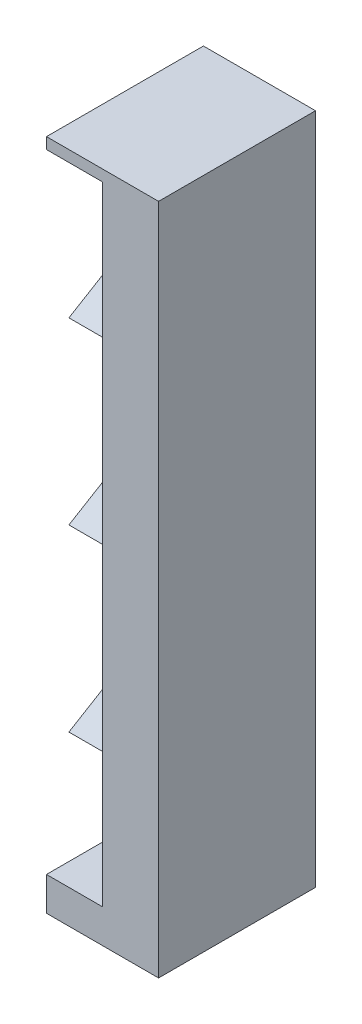
ISO-10303-21;
HEADER;
FILE_DESCRIPTION(('STEP AP214'),'2;1');
FILE_NAME('part.step','',(''),(''),'','','');
FILE_SCHEMA(('AUTOMOTIVE_DESIGN { 1 0 10303 214 1 1 1 1 }'));
ENDSEC;
DATA;
#1=APPLICATION_CONTEXT('core data for automotive mechanical design processes');
#2=APPLICATION_PROTOCOL_DEFINITION('international standard','automotive_design',2000,#1);
#3=PRODUCT_CONTEXT('',#1,'mechanical');
#4=PRODUCT('Part','Part','',(#3));
#5=PRODUCT_RELATED_PRODUCT_CATEGORY('part','',(#4));
#6=PRODUCT_DEFINITION_FORMATION('','',#4);
#7=PRODUCT_DEFINITION_CONTEXT('part definition',#1,'design');
#8=PRODUCT_DEFINITION('design','',#6,#7);
#9=PRODUCT_DEFINITION_SHAPE('','',#8);
#10=(LENGTH_UNIT() NAMED_UNIT(*) SI_UNIT(.MILLI.,.METRE.));
#11=(NAMED_UNIT(*) PLANE_ANGLE_UNIT() SI_UNIT($,.RADIAN.));
#12=(NAMED_UNIT(*) SI_UNIT($,.STERADIAN.) SOLID_ANGLE_UNIT());
#13=UNCERTAINTY_MEASURE_WITH_UNIT(LENGTH_MEASURE(1.E-05),#10,'distance_accuracy_value','');
#14=(GEOMETRIC_REPRESENTATION_CONTEXT(3) GLOBAL_UNCERTAINTY_ASSIGNED_CONTEXT((#13)) GLOBAL_UNIT_ASSIGNED_CONTEXT((#10,
#11,#12)) REPRESENTATION_CONTEXT('',''));
#15=CARTESIAN_POINT('',(0.,0.,0.));
#16=DIRECTION('',(0.,0.,1.));
#17=DIRECTION('',(1.,0.,0.));
#18=AXIS2_PLACEMENT_3D('',#15,#16,#17);
#19=CARTESIAN_POINT('',(-5.99706744868036,0.,0.));
#20=DIRECTION('',(1.,0.,0.));
#21=DIRECTION('',(0.,0.,-1.));
#22=AXIS2_PLACEMENT_3D('',#19,#20,#21);
#23=PLANE('',#22);
#24=DIRECTION('',(0.,-1.,0.));
#25=VECTOR('',#24,1.);
#26=CARTESIAN_POINT('',(-5.99706744868036,150.,24.633431085044));
#27=LINE('',#26,#25);
#28=CARTESIAN_POINT('',(-5.99706744868036,7.50000000000016,24.633431085044));
#29=VERTEX_POINT('',#28);
#30=CARTESIAN_POINT('',(-5.99706744868036,0.,24.633431085044));
#31=VERTEX_POINT('',#30);
#32=EDGE_CURVE('E254',#29,#31,#27,.T.);
#33=ORIENTED_EDGE('',*,*,#32,.F.);
#34=DIRECTION('',(0.,0.,-1.));
#35=VECTOR('',#34,1.);
#36=CARTESIAN_POINT('',(-5.99706744868036,7.50000000000015,-5.36656891495602));
#37=LINE('',#36,#35);
#38=CARTESIAN_POINT('',(-5.99706744868036,7.50000000000015,-5.36656891495602));
#39=VERTEX_POINT('',#38);
#40=EDGE_CURVE('E42',#29,#39,#37,.T.);
#41=ORIENTED_EDGE('',*,*,#40,.T.);
#42=DIRECTION('',(0.,1.,0.));
#43=VECTOR('',#42,1.);
#44=CARTESIAN_POINT('',(-5.99706744868036,7.50000000000015,-5.36656891495602));
#45=LINE('',#44,#43);
#46=CARTESIAN_POINT('',(-5.99706744868035,17.5000000000001,-5.36656891495603));
#47=VERTEX_POINT('',#46);
#48=EDGE_CURVE('E249',#39,#47,#45,.T.);
#49=ORIENTED_EDGE('',*,*,#48,.T.);
#50=DIRECTION('',(0.,-0.514495755427527,-0.857492925712544));
#51=VECTOR('',#50,1.);
#52=CARTESIAN_POINT('',(-5.99706744868035,17.5000000000001,-5.36656891495603));
#53=LINE('',#52,#51);
#54=CARTESIAN_POINT('',(-5.99706744868035,32.5000000000002,19.633431085044));
#55=VERTEX_POINT('',#54);
#56=EDGE_CURVE('E245',#55,#47,#53,.T.);
#57=ORIENTED_EDGE('',*,*,#56,.F.);
#58=DIRECTION('',(0.,-0.514495755427526,0.857492925712545));
#59=VECTOR('',#58,1.);
#60=CARTESIAN_POINT('',(-5.99706744868035,32.5000000000002,19.633431085044));
#61=LINE('',#60,#59);
#62=CARTESIAN_POINT('',(-5.99706744868035,47.5000000000001,-5.36656891495606));
#63=VERTEX_POINT('',#62);
#64=EDGE_CURVE('E246',#63,#55,#61,.T.);
#65=ORIENTED_EDGE('',*,*,#64,.F.);
#66=DIRECTION('',(0.,1.,0.));
#67=VECTOR('',#66,1.);
#68=CARTESIAN_POINT('',(-5.99706744868036,7.50000000000015,-5.36656891495602));
#69=LINE('',#68,#67);
#70=CARTESIAN_POINT('',(-5.99706744868035,57.5000000000001,-5.36656891495607));
#71=VERTEX_POINT('',#70);
#72=EDGE_CURVE('E235',#63,#71,#69,.T.);
#73=ORIENTED_EDGE('',*,*,#72,.T.);
#74=DIRECTION('',(0.,-0.514495755427527,-0.857492925712544));
#75=VECTOR('',#74,1.);
#76=CARTESIAN_POINT('',(-5.99706744868035,57.5000000000001,-5.36656891495607));
#77=LINE('',#76,#75);
#78=CARTESIAN_POINT('',(-5.99706744868035,72.5000000000002,19.6334310850439));
#79=VERTEX_POINT('',#78);
#80=EDGE_CURVE('E159',#79,#71,#77,.T.);
#81=ORIENTED_EDGE('',*,*,#80,.F.);
#82=DIRECTION('',(0.,-0.514495755427526,0.857492925712545));
#83=VECTOR('',#82,1.);
#84=CARTESIAN_POINT('',(-5.99706744868035,72.5000000000002,19.6334310850439));
#85=LINE('',#84,#83);
#86=CARTESIAN_POINT('',(-5.99706744868035,87.5000000000001,-5.3665689149561));
#87=VERTEX_POINT('',#86);
#88=EDGE_CURVE('E232',#87,#79,#85,.T.);
#89=ORIENTED_EDGE('',*,*,#88,.F.);
#90=DIRECTION('',(0.,1.,0.));
#91=VECTOR('',#90,1.);
#92=CARTESIAN_POINT('',(-5.99706744868036,7.50000000000015,-5.36656891495602));
#93=LINE('',#92,#91);
#94=CARTESIAN_POINT('',(-5.99706744868035,97.5000000000001,-5.36656891495611));
#95=VERTEX_POINT('',#94);
#96=EDGE_CURVE('E238',#87,#95,#93,.T.);
#97=ORIENTED_EDGE('',*,*,#96,.T.);
#98=DIRECTION('',(0.,-0.514495755427527,-0.857492925712544));
#99=VECTOR('',#98,1.);
#100=CARTESIAN_POINT('',(-5.99706744868035,97.5000000000001,-5.36656891495611));
#101=LINE('',#100,#99);
#102=CARTESIAN_POINT('',(-5.99706744868035,112.5,19.6334310850439));
#103=VERTEX_POINT('',#102);
#104=EDGE_CURVE('E234',#103,#95,#101,.T.);
#105=ORIENTED_EDGE('',*,*,#104,.F.);
#106=DIRECTION('',(0.,-0.514495755427526,0.857492925712545));
#107=VECTOR('',#106,1.);
#108=CARTESIAN_POINT('',(-5.99706744868035,112.5,19.6334310850439));
#109=LINE('',#108,#107);
#110=CARTESIAN_POINT('',(-5.99706744868035,127.5,-5.36656891495614));
#111=VERTEX_POINT('',#110);
#112=EDGE_CURVE('E243',#111,#103,#109,.T.);
#113=ORIENTED_EDGE('',*,*,#112,.F.);
#114=DIRECTION('',(0.,1.,0.));
#115=VECTOR('',#114,1.);
#116=CARTESIAN_POINT('',(-5.99706744868036,7.50000000000015,-5.36656891495602));
#117=LINE('',#116,#115);
#118=CARTESIAN_POINT('',(-5.99706744868036,147.5,-5.36656891495616));
#119=VERTEX_POINT('',#118);
#120=EDGE_CURVE('E237',#111,#119,#117,.T.);
#121=ORIENTED_EDGE('',*,*,#120,.T.);
#122=DIRECTION('',(0.,0.,1.));
#123=VECTOR('',#122,1.);
#124=CARTESIAN_POINT('',(-5.99706744868036,147.5,-5.36656891495616));
#125=LINE('',#124,#123);
#126=CARTESIAN_POINT('',(-5.99706744868036,147.5,24.6334310850438));
#127=VERTEX_POINT('',#126);
#128=EDGE_CURVE('E11',#119,#127,#125,.T.);
#129=ORIENTED_EDGE('',*,*,#128,.T.);
#130=CARTESIAN_POINT('',(-5.99706744868036,150.,24.633431085044));
#131=VERTEX_POINT('',#130);
#132=EDGE_CURVE('E50',#131,#127,#27,.T.);
#133=ORIENTED_EDGE('',*,*,#132,.F.);
#134=DIRECTION('',(0.,0.,-1.));
#135=VECTOR('',#134,1.);
#136=CARTESIAN_POINT('',(-5.99706744868036,150.,0.));
#137=LINE('',#136,#135);
#138=CARTESIAN_POINT('',(-5.99706744868036,150.,-10.366568914956));
#139=VERTEX_POINT('',#138);
#140=EDGE_CURVE('E241',#131,#139,#137,.T.);
#141=ORIENTED_EDGE('',*,*,#140,.T.);
#142=DIRECTION('',(0.,1.,0.));
#143=VECTOR('',#142,1.);
#144=CARTESIAN_POINT('',(-5.99706744868036,150.,-10.366568914956));
#145=LINE('',#144,#143);
#146=CARTESIAN_POINT('',(-5.99706744868036,0.,-10.366568914956));
#147=VERTEX_POINT('',#146);
#148=EDGE_CURVE('E258',#147,#139,#145,.T.);
#149=ORIENTED_EDGE('',*,*,#148,.F.);
#150=DIRECTION('',(0.,0.,-1.));
#151=VECTOR('',#150,1.);
#152=CARTESIAN_POINT('',(-5.99706744868036,0.,0.));
#153=LINE('',#152,#151);
#154=EDGE_CURVE('E37',#31,#147,#153,.T.);
#155=ORIENTED_EDGE('',*,*,#154,.F.);
#156=EDGE_LOOP('',(#33,#41,#49,#57,#65,#73,#81,#89,#97,#105,#113,#121,#129,#133,#141,#149,#155));
#157=FACE_BOUND('',#156,.T.);
#158=ADVANCED_FACE('F34',(#157),#23,.F.);
#159=CARTESIAN_POINT('',(19.0029325513196,150.,-10.366568914956));
#160=DIRECTION('',(-1.,0.,0.));
#161=DIRECTION('',(0.,0.,1.));
#162=AXIS2_PLACEMENT_3D('',#159,#160,#161);
#163=PLANE('',#162);
#164=DIRECTION('',(0.,0.,-1.));
#165=VECTOR('',#164,1.);
#166=CARTESIAN_POINT('',(19.0029325513196,0.,-10.366568914956));
#167=LINE('',#166,#165);
#168=CARTESIAN_POINT('',(19.0029325513197,0.,24.633431085044));
#169=VERTEX_POINT('',#168);
#170=CARTESIAN_POINT('',(19.0029325513196,0.,-10.366568914956));
#171=VERTEX_POINT('',#170);
#172=EDGE_CURVE('E222',#169,#171,#167,.T.);
#173=ORIENTED_EDGE('',*,*,#172,.T.);
#174=DIRECTION('',(0.,-1.,0.));
#175=VECTOR('',#174,1.);
#176=CARTESIAN_POINT('',(19.0029325513196,150.,-10.366568914956));
#177=LINE('',#176,#175);
#178=CARTESIAN_POINT('',(19.0029325513196,150.,-10.366568914956));
#179=VERTEX_POINT('',#178);
#180=EDGE_CURVE('E220',#179,#171,#177,.T.);
#181=ORIENTED_EDGE('',*,*,#180,.F.);
#182=DIRECTION('',(0.,0.,-1.));
#183=VECTOR('',#182,1.);
#184=CARTESIAN_POINT('',(19.0029325513196,150.,-10.366568914956));
#185=LINE('',#184,#183);
#186=CARTESIAN_POINT('',(19.0029325513197,150.,24.633431085044));
#187=VERTEX_POINT('',#186);
#188=EDGE_CURVE('E214',#187,#179,#185,.T.);
#189=ORIENTED_EDGE('',*,*,#188,.F.);
#190=DIRECTION('',(0.,-1.,0.));
#191=VECTOR('',#190,1.);
#192=CARTESIAN_POINT('',(19.0029325513197,150.,24.633431085044));
#193=LINE('',#192,#191);
#194=EDGE_CURVE('E228',#187,#169,#193,.T.);
#195=ORIENTED_EDGE('',*,*,#194,.T.);
#196=EDGE_LOOP('',(#173,#181,#189,#195));
#197=FACE_BOUND('',#196,.T.);
#198=ADVANCED_FACE('F274',(#197),#163,.F.);
#199=CARTESIAN_POINT('',(-20.9970674486804,150.,-10.366568914956));
#200=DIRECTION('',(0.,0.,1.));
#201=DIRECTION('',(1.,0.,0.));
#202=AXIS2_PLACEMENT_3D('',#199,#200,#201);
#203=PLANE('',#202);
#204=DIRECTION('',(-1.,0.,0.));
#205=VECTOR('',#204,1.);
#206=CARTESIAN_POINT('',(-20.9970674486804,0.,-10.366568914956));
#207=LINE('',#206,#205);
#208=EDGE_CURVE('E215',#171,#147,#207,.T.);
#209=ORIENTED_EDGE('',*,*,#208,.T.);
#210=ORIENTED_EDGE('',*,*,#148,.T.);
#211=DIRECTION('',(-1.,0.,0.));
#212=VECTOR('',#211,1.);
#213=CARTESIAN_POINT('',(-20.9970674486804,150.,-10.366568914956));
#214=LINE('',#213,#212);
#215=EDGE_CURVE('E217',#179,#139,#214,.T.);
#216=ORIENTED_EDGE('',*,*,#215,.F.);
#217=ORIENTED_EDGE('',*,*,#180,.T.);
#218=EDGE_LOOP('',(#209,#210,#216,#217));
#219=FACE_BOUND('',#218,.T.);
#220=ADVANCED_FACE('F270',(#219),#203,.F.);
#221=CARTESIAN_POINT('',(-20.9970674486804,150.,24.633431085044));
#222=DIRECTION('',(0.,0.,-1.));
#223=DIRECTION('',(-1.,0.,0.));
#224=AXIS2_PLACEMENT_3D('',#221,#222,#223);
#225=PLANE('',#224);
#226=DIRECTION('',(1.,0.,0.));
#227=VECTOR('',#226,1.);
#228=CARTESIAN_POINT('',(-20.9970674486804,150.,24.633431085044));
#229=LINE('',#228,#227);
#230=EDGE_CURVE('E212',#131,#187,#229,.T.);
#231=ORIENTED_EDGE('',*,*,#230,.F.);
#232=ORIENTED_EDGE('',*,*,#132,.T.);
#233=DIRECTION('',(1.,0.,0.));
#234=VECTOR('',#233,1.);
#235=CARTESIAN_POINT('',(-18.4970674486804,147.5,24.6334310850438));
#236=LINE('',#235,#234);
#237=CARTESIAN_POINT('',(6.50293255131965,147.5,24.633431085044));
#238=VERTEX_POINT('',#237);
#239=EDGE_CURVE('E205',#127,#238,#236,.T.);
#240=ORIENTED_EDGE('',*,*,#239,.T.);
#241=DIRECTION('',(0.,1.,0.));
#242=VECTOR('',#241,1.);
#243=CARTESIAN_POINT('',(6.50293255131965,7.50000000000016,24.633431085044));
#244=LINE('',#243,#242);
#245=CARTESIAN_POINT('',(6.50293255131965,7.50000000000016,24.633431085044));
#246=VERTEX_POINT('',#245);
#247=EDGE_CURVE('E195',#246,#238,#244,.T.);
#248=ORIENTED_EDGE('',*,*,#247,.F.);
#249=DIRECTION('',(1.,0.,0.));
#250=VECTOR('',#249,1.);
#251=CARTESIAN_POINT('',(-18.4970674486804,7.50000000000016,24.633431085044));
#252=LINE('',#251,#250);
#253=EDGE_CURVE('E207',#29,#246,#252,.T.);
#254=ORIENTED_EDGE('',*,*,#253,.F.);
#255=ORIENTED_EDGE('',*,*,#32,.T.);
#256=DIRECTION('',(1.,0.,0.));
#257=VECTOR('',#256,1.);
#258=CARTESIAN_POINT('',(-20.9970674486804,0.,24.633431085044));
#259=LINE('',#258,#257);
#260=EDGE_CURVE('E211',#31,#169,#259,.T.);
#261=ORIENTED_EDGE('',*,*,#260,.T.);
#262=ORIENTED_EDGE('',*,*,#194,.F.);
#263=EDGE_LOOP('',(#231,#232,#240,#248,#254,#255,#261,#262));
#264=FACE_BOUND('',#263,.T.);
#265=ADVANCED_FACE('F276',(#264),#225,.F.);
#266=CARTESIAN_POINT('',(-18.4970674486804,7.50000000000015,-5.36656891495602));
#267=DIRECTION('',(0.,0.,1.));
#268=DIRECTION('',(0.,1.,0.));
#269=AXIS2_PLACEMENT_3D('',#266,#267,#268);
#270=PLANE('',#269);
#271=ORIENTED_EDGE('',*,*,#120,.F.);
#272=DIRECTION('',(1.,0.,0.));
#273=VECTOR('',#272,1.);
#274=CARTESIAN_POINT('',(-57.5483158282136,127.5,-5.36656891495614));
#275=LINE('',#274,#273);
#276=CARTESIAN_POINT('',(6.50293255131965,127.5,-5.36656891495614));
#277=VERTEX_POINT('',#276);
#278=EDGE_CURVE('E469',#111,#277,#275,.T.);
#279=ORIENTED_EDGE('',*,*,#278,.T.);
#280=DIRECTION('',(0.,-1.,0.));
#281=VECTOR('',#280,1.);
#282=CARTESIAN_POINT('',(6.50293255131965,7.50000000000015,-5.36656891495602));
#283=LINE('',#282,#281);
#284=CARTESIAN_POINT('',(6.50293255131965,147.5,-5.36656891495616));
#285=VERTEX_POINT('',#284);
#286=EDGE_CURVE('E184',#285,#277,#283,.T.);
#287=ORIENTED_EDGE('',*,*,#286,.F.);
#288=DIRECTION('',(1.,0.,0.));
#289=VECTOR('',#288,1.);
#290=CARTESIAN_POINT('',(-18.4970674486804,147.5,-5.36656891495616));
#291=LINE('',#290,#289);
#292=EDGE_CURVE('E203',#119,#285,#291,.T.);
#293=ORIENTED_EDGE('',*,*,#292,.F.);
#294=EDGE_LOOP('',(#271,#279,#287,#293));
#295=FACE_BOUND('',#294,.T.);
#296=ADVANCED_FACE('F313',(#295),#270,.T.);
#297=ORIENTED_EDGE('',*,*,#96,.F.);
#298=DIRECTION('',(1.,0.,0.));
#299=VECTOR('',#298,1.);
#300=CARTESIAN_POINT('',(-57.5483158282136,87.5000000000001,-5.3665689149561));
#301=LINE('',#300,#299);
#302=CARTESIAN_POINT('',(6.50293255131965,87.5000000000001,-5.3665689149561));
#303=VERTEX_POINT('',#302);
#304=EDGE_CURVE('E476',#87,#303,#301,.T.);
#305=ORIENTED_EDGE('',*,*,#304,.T.);
#306=CARTESIAN_POINT('',(6.50293255131965,97.5000000000001,-5.36656891495611));
#307=VERTEX_POINT('',#306);
#308=EDGE_CURVE('E181',#307,#303,#283,.T.);
#309=ORIENTED_EDGE('',*,*,#308,.F.);
#310=DIRECTION('',(1.,0.,0.));
#311=VECTOR('',#310,1.);
#312=CARTESIAN_POINT('',(-57.5483158282136,97.5000000000001,-5.36656891495611));
#313=LINE('',#312,#311);
#314=EDGE_CURVE('E176',#95,#307,#313,.T.);
#315=ORIENTED_EDGE('',*,*,#314,.F.);
#316=EDGE_LOOP('',(#297,#305,#309,#315));
#317=FACE_BOUND('',#316,.T.);
#318=ADVANCED_FACE('F312',(#317),#270,.T.);
#319=CARTESIAN_POINT('',(6.50293255131965,7.50000000000015,-5.36656891495602));
#320=DIRECTION('',(1.,0.,0.));
#321=DIRECTION('',(0.,1.,0.));
#322=AXIS2_PLACEMENT_3D('',#319,#320,#321);
#323=PLANE('',#322);
#324=DIRECTION('',(0.,0.514495755427527,0.857492925712544));
#325=VECTOR('',#324,1.);
#326=CARTESIAN_POINT('',(6.50293255131965,57.5000000000001,-5.36656891495607));
#327=LINE('',#326,#325);
#328=CARTESIAN_POINT('',(6.50293255131965,57.5000000000001,-5.36656891495607));
#329=VERTEX_POINT('',#328);
#330=CARTESIAN_POINT('',(6.50293255131965,72.5000000000002,19.6334310850439));
#331=VERTEX_POINT('',#330);
#332=EDGE_CURVE('E157',#329,#331,#327,.T.);
#333=ORIENTED_EDGE('',*,*,#332,.F.);
#334=CARTESIAN_POINT('',(6.50293255131965,47.5000000000001,-5.36656891495606));
#335=VERTEX_POINT('',#334);
#336=EDGE_CURVE('E171',#329,#335,#283,.T.);
#337=ORIENTED_EDGE('',*,*,#336,.T.);
#338=DIRECTION('',(0.,0.514495755427526,-0.857492925712545));
#339=VECTOR('',#338,1.);
#340=CARTESIAN_POINT('',(6.50293255131965,32.5000000000002,19.633431085044));
#341=LINE('',#340,#339);
#342=CARTESIAN_POINT('',(6.50293255131965,32.5000000000002,19.633431085044));
#343=VERTEX_POINT('',#342);
#344=EDGE_CURVE('E288',#343,#335,#341,.T.);
#345=ORIENTED_EDGE('',*,*,#344,.F.);
#346=DIRECTION('',(0.,0.514495755427527,0.857492925712544));
#347=VECTOR('',#346,1.);
#348=CARTESIAN_POINT('',(6.50293255131965,17.5000000000001,-5.36656891495603));
#349=LINE('',#348,#347);
#350=CARTESIAN_POINT('',(6.50293255131965,17.5000000000001,-5.36656891495603));
#351=VERTEX_POINT('',#350);
#352=EDGE_CURVE('E163',#351,#343,#349,.T.);
#353=ORIENTED_EDGE('',*,*,#352,.F.);
#354=CARTESIAN_POINT('',(6.50293255131965,7.50000000000015,-5.36656891495602));
#355=VERTEX_POINT('',#354);
#356=EDGE_CURVE('E182',#351,#355,#283,.T.);
#357=ORIENTED_EDGE('',*,*,#356,.T.);
#358=DIRECTION('',(0.,0.,1.));
#359=VECTOR('',#358,1.);
#360=CARTESIAN_POINT('',(6.50293255131965,7.50000000000015,-5.36656891495602));
#361=LINE('',#360,#359);
#362=EDGE_CURVE('E190',#355,#246,#361,.T.);
#363=ORIENTED_EDGE('',*,*,#362,.T.);
#364=ORIENTED_EDGE('',*,*,#247,.T.);
#365=DIRECTION('',(0.,0.,-1.));
#366=VECTOR('',#365,1.);
#367=CARTESIAN_POINT('',(6.50293255131965,147.5,-5.36656891495616));
#368=LINE('',#367,#366);
#369=EDGE_CURVE('E199',#238,#285,#368,.T.);
#370=ORIENTED_EDGE('',*,*,#369,.T.);
#371=ORIENTED_EDGE('',*,*,#286,.T.);
#372=DIRECTION('',(0.,0.514495755427526,-0.857492925712545));
#373=VECTOR('',#372,1.);
#374=CARTESIAN_POINT('',(6.50293255131965,112.5,19.6334310850439));
#375=LINE('',#374,#373);
#376=CARTESIAN_POINT('',(6.50293255131965,112.5,19.6334310850439));
#377=VERTEX_POINT('',#376);
#378=EDGE_CURVE('E470',#377,#277,#375,.T.);
#379=ORIENTED_EDGE('',*,*,#378,.F.);
#380=DIRECTION('',(0.,0.514495755427527,0.857492925712544));
#381=VECTOR('',#380,1.);
#382=CARTESIAN_POINT('',(6.50293255131965,97.5000000000001,-5.36656891495611));
#383=LINE('',#382,#381);
#384=EDGE_CURVE('E467',#307,#377,#383,.T.);
#385=ORIENTED_EDGE('',*,*,#384,.F.);
#386=ORIENTED_EDGE('',*,*,#308,.T.);
#387=DIRECTION('',(0.,0.514495755427526,-0.857492925712545));
#388=VECTOR('',#387,1.);
#389=CARTESIAN_POINT('',(6.50293255131965,72.5000000000002,19.6334310850439));
#390=LINE('',#389,#388);
#391=EDGE_CURVE('E175',#331,#303,#390,.T.);
#392=ORIENTED_EDGE('',*,*,#391,.F.);
#393=EDGE_LOOP('',(#333,#337,#345,#353,#357,#363,#364,#370,#371,#379,#385,#386,#392));
#394=FACE_BOUND('',#393,.T.);
#395=ADVANCED_FACE('F169',(#394),#323,.F.);
#396=ORIENTED_EDGE('',*,*,#72,.F.);
#397=DIRECTION('',(1.,0.,0.));
#398=VECTOR('',#397,1.);
#399=CARTESIAN_POINT('',(-57.5483158282136,47.5000000000001,-5.36656891495606));
#400=LINE('',#399,#398);
#401=EDGE_CURVE('E180',#63,#335,#400,.T.);
#402=ORIENTED_EDGE('',*,*,#401,.T.);
#403=ORIENTED_EDGE('',*,*,#336,.F.);
#404=DIRECTION('',(1.,0.,0.));
#405=VECTOR('',#404,1.);
#406=CARTESIAN_POINT('',(-57.5483158282136,57.5000000000001,-5.36656891495607));
#407=LINE('',#406,#405);
#408=EDGE_CURVE('E153',#71,#329,#407,.T.);
#409=ORIENTED_EDGE('',*,*,#408,.F.);
#410=EDGE_LOOP('',(#396,#402,#403,#409));
#411=FACE_BOUND('',#410,.T.);
#412=ADVANCED_FACE('F178',(#411),#270,.T.);
#413=CARTESIAN_POINT('',(-57.5483158282136,72.5000000000002,19.6334310850439));
#414=DIRECTION('',(0.,-0.857492925712545,-0.514495755427526));
#415=DIRECTION('',(0.,-0.514495755427526,0.857492925712545));
#416=AXIS2_PLACEMENT_3D('',#413,#414,#415);
#417=PLANE('',#416);
#418=ORIENTED_EDGE('',*,*,#304,.F.);
#419=ORIENTED_EDGE('',*,*,#88,.T.);
#420=DIRECTION('',(1.,0.,0.));
#421=VECTOR('',#420,1.);
#422=CARTESIAN_POINT('',(-57.5483158282136,72.5000000000002,19.6334310850439));
#423=LINE('',#422,#421);
#424=EDGE_CURVE('E164',#79,#331,#423,.T.);
#425=ORIENTED_EDGE('',*,*,#424,.T.);
#426=ORIENTED_EDGE('',*,*,#391,.T.);
#427=EDGE_LOOP('',(#418,#419,#425,#426));
#428=FACE_BOUND('',#427,.T.);
#429=ADVANCED_FACE('F342',(#428),#417,.F.);
#430=CARTESIAN_POINT('',(-57.5483158282136,57.5000000000001,-5.36656891495607));
#431=DIRECTION('',(0.,0.857492925712544,-0.514495755427527));
#432=DIRECTION('',(0.,-0.514495755427527,-0.857492925712544));
#433=AXIS2_PLACEMENT_3D('',#430,#431,#432);
#434=PLANE('',#433);
#435=ORIENTED_EDGE('',*,*,#424,.F.);
#436=ORIENTED_EDGE('',*,*,#80,.T.);
#437=ORIENTED_EDGE('',*,*,#408,.T.);
#438=ORIENTED_EDGE('',*,*,#332,.T.);
#439=EDGE_LOOP('',(#435,#436,#437,#438));
#440=FACE_BOUND('',#439,.T.);
#441=ADVANCED_FACE('F156',(#440),#434,.F.);
#442=CARTESIAN_POINT('',(-57.5483158282136,112.5,19.6334310850439));
#443=DIRECTION('',(0.,-0.857492925712545,-0.514495755427526));
#444=DIRECTION('',(0.,-0.514495755427526,0.857492925712545));
#445=AXIS2_PLACEMENT_3D('',#442,#443,#444);
#446=PLANE('',#445);
#447=ORIENTED_EDGE('',*,*,#278,.F.);
#448=ORIENTED_EDGE('',*,*,#112,.T.);
#449=DIRECTION('',(1.,0.,0.));
#450=VECTOR('',#449,1.);
#451=CARTESIAN_POINT('',(-57.5483158282136,112.5,19.6334310850439));
#452=LINE('',#451,#450);
#453=EDGE_CURVE('E464',#103,#377,#452,.T.);
#454=ORIENTED_EDGE('',*,*,#453,.T.);
#455=ORIENTED_EDGE('',*,*,#378,.T.);
#456=EDGE_LOOP('',(#447,#448,#454,#455));
#457=FACE_BOUND('',#456,.T.);
#458=ADVANCED_FACE('F419',(#457),#446,.F.);
#459=CARTESIAN_POINT('',(-57.5483158282136,97.5000000000001,-5.36656891495611));
#460=DIRECTION('',(0.,0.857492925712544,-0.514495755427527));
#461=DIRECTION('',(0.,-0.514495755427527,-0.857492925712544));
#462=AXIS2_PLACEMENT_3D('',#459,#460,#461);
#463=PLANE('',#462);
#464=ORIENTED_EDGE('',*,*,#453,.F.);
#465=ORIENTED_EDGE('',*,*,#104,.T.);
#466=ORIENTED_EDGE('',*,*,#314,.T.);
#467=ORIENTED_EDGE('',*,*,#384,.T.);
#468=EDGE_LOOP('',(#464,#465,#466,#467));
#469=FACE_BOUND('',#468,.T.);
#470=ADVANCED_FACE('F310',(#469),#463,.F.);
#471=ORIENTED_EDGE('',*,*,#48,.F.);
#472=DIRECTION('',(1.,0.,0.));
#473=VECTOR('',#472,1.);
#474=CARTESIAN_POINT('',(-18.4970674486804,7.50000000000015,-5.36656891495602));
#475=LINE('',#474,#473);
#476=EDGE_CURVE('E209',#39,#355,#475,.T.);
#477=ORIENTED_EDGE('',*,*,#476,.T.);
#478=ORIENTED_EDGE('',*,*,#356,.F.);
#479=DIRECTION('',(1.,0.,0.));
#480=VECTOR('',#479,1.);
#481=CARTESIAN_POINT('',(-57.5483158282136,17.5000000000001,-5.36656891495603));
#482=LINE('',#481,#480);
#483=EDGE_CURVE('E186',#47,#351,#482,.T.);
#484=ORIENTED_EDGE('',*,*,#483,.F.);
#485=EDGE_LOOP('',(#471,#477,#478,#484));
#486=FACE_BOUND('',#485,.T.);
#487=ADVANCED_FACE('F285',(#486),#270,.T.);
#488=CARTESIAN_POINT('',(-57.5483158282136,32.5000000000002,19.633431085044));
#489=DIRECTION('',(0.,-0.857492925712545,-0.514495755427526));
#490=DIRECTION('',(0.,-0.514495755427526,0.857492925712545));
#491=AXIS2_PLACEMENT_3D('',#488,#489,#490);
#492=PLANE('',#491);
#493=ORIENTED_EDGE('',*,*,#401,.F.);
#494=ORIENTED_EDGE('',*,*,#64,.T.);
#495=DIRECTION('',(1.,0.,0.));
#496=VECTOR('',#495,1.);
#497=CARTESIAN_POINT('',(-57.5483158282136,32.5000000000002,19.633431085044));
#498=LINE('',#497,#496);
#499=EDGE_CURVE('E297',#55,#343,#498,.T.);
#500=ORIENTED_EDGE('',*,*,#499,.T.);
#501=ORIENTED_EDGE('',*,*,#344,.T.);
#502=EDGE_LOOP('',(#493,#494,#500,#501));
#503=FACE_BOUND('',#502,.T.);
#504=ADVANCED_FACE('F301',(#503),#492,.F.);
#505=CARTESIAN_POINT('',(-57.5483158282136,17.5000000000001,-5.36656891495603));
#506=DIRECTION('',(0.,0.857492925712544,-0.514495755427527));
#507=DIRECTION('',(0.,-0.514495755427527,-0.857492925712544));
#508=AXIS2_PLACEMENT_3D('',#505,#506,#507);
#509=PLANE('',#508);
#510=ORIENTED_EDGE('',*,*,#499,.F.);
#511=ORIENTED_EDGE('',*,*,#56,.T.);
#512=ORIENTED_EDGE('',*,*,#483,.T.);
#513=ORIENTED_EDGE('',*,*,#352,.T.);
#514=EDGE_LOOP('',(#510,#511,#512,#513));
#515=FACE_BOUND('',#514,.T.);
#516=ADVANCED_FACE('F298',(#515),#509,.F.);
#517=CARTESIAN_POINT('',(-18.4970674486804,147.5,-5.36656891495616));
#518=DIRECTION('',(0.,-1.,0.));
#519=DIRECTION('',(0.,0.,1.));
#520=AXIS2_PLACEMENT_3D('',#517,#518,#519);
#521=PLANE('',#520);
#522=ORIENTED_EDGE('',*,*,#128,.F.);
#523=ORIENTED_EDGE('',*,*,#292,.T.);
#524=ORIENTED_EDGE('',*,*,#369,.F.);
#525=ORIENTED_EDGE('',*,*,#239,.F.);
#526=EDGE_LOOP('',(#522,#523,#524,#525));
#527=FACE_BOUND('',#526,.T.);
#528=ADVANCED_FACE('F308',(#527),#521,.T.);
#529=CARTESIAN_POINT('',(-18.4970674486804,7.50000000000015,-5.36656891495602));
#530=DIRECTION('',(0.,1.,0.));
#531=DIRECTION('',(0.,0.,-1.));
#532=AXIS2_PLACEMENT_3D('',#529,#530,#531);
#533=PLANE('',#532);
#534=ORIENTED_EDGE('',*,*,#40,.F.);
#535=ORIENTED_EDGE('',*,*,#253,.T.);
#536=ORIENTED_EDGE('',*,*,#362,.F.);
#537=ORIENTED_EDGE('',*,*,#476,.F.);
#538=EDGE_LOOP('',(#534,#535,#536,#537));
#539=FACE_BOUND('',#538,.T.);
#540=ADVANCED_FACE('F282',(#539),#533,.T.);
#541=CARTESIAN_POINT('',(0.,0.,0.));
#542=DIRECTION('',(0.,1.,0.));
#543=DIRECTION('',(0.,0.,1.));
#544=AXIS2_PLACEMENT_3D('',#541,#542,#543);
#545=PLANE('',#544);
#546=ORIENTED_EDGE('',*,*,#260,.F.);
#547=ORIENTED_EDGE('',*,*,#154,.T.);
#548=ORIENTED_EDGE('',*,*,#208,.F.);
#549=ORIENTED_EDGE('',*,*,#172,.F.);
#550=EDGE_LOOP('',(#546,#547,#548,#549));
#551=FACE_BOUND('',#550,.T.);
#552=ADVANCED_FACE('F266',(#551),#545,.F.);
#553=CARTESIAN_POINT('',(0.,150.,0.));
#554=DIRECTION('',(0.,1.,0.));
#555=DIRECTION('',(0.,0.,1.));
#556=AXIS2_PLACEMENT_3D('',#553,#554,#555);
#557=PLANE('',#556);
#558=ORIENTED_EDGE('',*,*,#140,.F.);
#559=ORIENTED_EDGE('',*,*,#230,.T.);
#560=ORIENTED_EDGE('',*,*,#188,.T.);
#561=ORIENTED_EDGE('',*,*,#215,.T.);
#562=EDGE_LOOP('',(#558,#559,#560,#561));
#563=FACE_BOUND('',#562,.T.);
#564=ADVANCED_FACE('F316',(#563),#557,.T.);
#565=CLOSED_SHELL('',(#158,#198,#220,#265,#296,#318,#395,#412,#429,#441,#458,#470,#487,#504,
#516,#528,#540,#552,#564));
#566=MANIFOLD_SOLID_BREP('B2',#565);
#567=ADVANCED_BREP_SHAPE_REPRESENTATION('',(#18,#566),#14);
#568=SHAPE_DEFINITION_REPRESENTATION(#9,#567);
ENDSEC;
END-ISO-10303-21;
